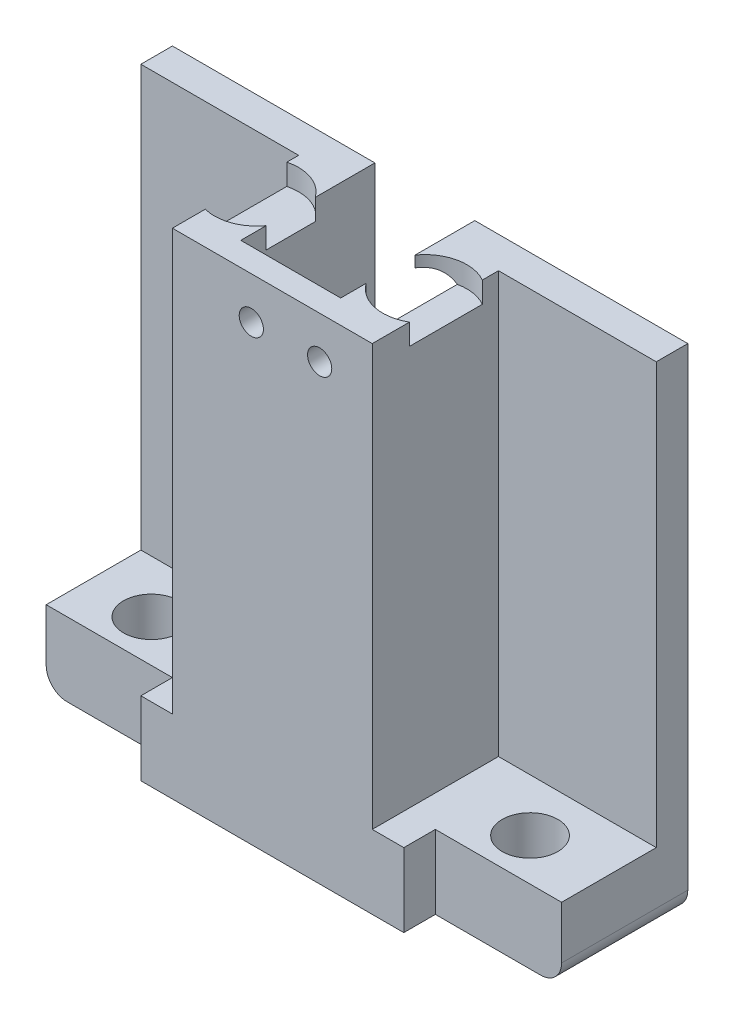
ISO-10303-21;
HEADER;
FILE_DESCRIPTION(('STEP AP214'),'2;1');
FILE_NAME('part.step','',(''),(''),'','','');
FILE_SCHEMA(('AUTOMOTIVE_DESIGN { 1 0 10303 214 1 1 1 1 }'));
ENDSEC;
DATA;
#1=APPLICATION_CONTEXT('core data for automotive mechanical design processes');
#2=APPLICATION_PROTOCOL_DEFINITION('international standard','automotive_design',2000,#1);
#3=PRODUCT_CONTEXT('',#1,'mechanical');
#4=PRODUCT('Part','Part','',(#3));
#5=PRODUCT_RELATED_PRODUCT_CATEGORY('part','',(#4));
#6=PRODUCT_DEFINITION_FORMATION('','',#4);
#7=PRODUCT_DEFINITION_CONTEXT('part definition',#1,'design');
#8=PRODUCT_DEFINITION('design','',#6,#7);
#9=PRODUCT_DEFINITION_SHAPE('','',#8);
#10=(LENGTH_UNIT() NAMED_UNIT(*) SI_UNIT(.MILLI.,.METRE.));
#11=(NAMED_UNIT(*) PLANE_ANGLE_UNIT() SI_UNIT($,.RADIAN.));
#12=(NAMED_UNIT(*) SI_UNIT($,.STERADIAN.) SOLID_ANGLE_UNIT());
#13=UNCERTAINTY_MEASURE_WITH_UNIT(LENGTH_MEASURE(1.E-05),#10,'distance_accuracy_value','');
#14=(GEOMETRIC_REPRESENTATION_CONTEXT(3) GLOBAL_UNCERTAINTY_ASSIGNED_CONTEXT((#13)) GLOBAL_UNIT_ASSIGNED_CONTEXT((#10,
#11,#12)) REPRESENTATION_CONTEXT('',''));
#15=CARTESIAN_POINT('',(0.,0.,0.));
#16=DIRECTION('',(0.,0.,1.));
#17=DIRECTION('',(1.,0.,0.));
#18=AXIS2_PLACEMENT_3D('',#15,#16,#17);
#19=CARTESIAN_POINT('',(0.,47.,0.));
#20=DIRECTION('',(0.,1.,0.));
#21=DIRECTION('',(0.,0.,1.));
#22=AXIS2_PLACEMENT_3D('',#19,#20,#21);
#23=PLANE('',#22);
#24=CARTESIAN_POINT('',(-17.,47.,8.));
#25=DIRECTION('',(0.,1.,0.));
#26=DIRECTION('',(0.,0.,1.));
#27=AXIS2_PLACEMENT_3D('',#24,#25,#26);
#28=CIRCLE('',#27,4.);
#29=CARTESIAN_POINT('',(-15.,47.,4.53589838486224));
#30=VERTEX_POINT('',#29);
#31=CARTESIAN_POINT('',(-20.25,47.,5.66815523672779));
#32=VERTEX_POINT('',#31);
#33=EDGE_CURVE('E271',#30,#32,#28,.T.);
#34=ORIENTED_EDGE('',*,*,#33,.F.);
#35=DIRECTION('',(0.,0.,1.));
#36=VECTOR('',#35,1.);
#37=CARTESIAN_POINT('',(-15.,47.,0.));
#38=LINE('',#37,#36);
#39=CARTESIAN_POINT('',(-15.,47.,3.));
#40=VERTEX_POINT('',#39);
#41=EDGE_CURVE('E558',#40,#30,#38,.T.);
#42=ORIENTED_EDGE('',*,*,#41,.F.);
#43=DIRECTION('',(-1.,0.,0.));
#44=VECTOR('',#43,1.);
#45=CARTESIAN_POINT('',(0.,47.,3.));
#46=LINE('',#45,#44);
#47=CARTESIAN_POINT('',(0.,47.,3.));
#48=VERTEX_POINT('',#47);
#49=EDGE_CURVE('E395',#48,#40,#46,.T.);
#50=ORIENTED_EDGE('',*,*,#49,.F.);
#51=DIRECTION('',(0.,0.,-1.));
#52=VECTOR('',#51,1.);
#53=CARTESIAN_POINT('',(0.,47.,16.));
#54=LINE('',#53,#52);
#55=CARTESIAN_POINT('',(0.,47.,0.));
#56=VERTEX_POINT('',#55);
#57=EDGE_CURVE('E406',#48,#56,#54,.T.);
#58=ORIENTED_EDGE('',*,*,#57,.T.);
#59=DIRECTION('',(-1.,0.,0.));
#60=VECTOR('',#59,1.);
#61=CARTESIAN_POINT('',(0.,47.,0.));
#62=LINE('',#61,#60);
#63=CARTESIAN_POINT('',(-20.25,47.,0.));
#64=VERTEX_POINT('',#63);
#65=EDGE_CURVE('E403',#56,#64,#62,.T.);
#66=ORIENTED_EDGE('',*,*,#65,.T.);
#67=DIRECTION('',(0.,0.,1.));
#68=VECTOR('',#67,1.);
#69=CARTESIAN_POINT('',(-20.25,47.,0.));
#70=LINE('',#69,#68);
#71=EDGE_CURVE('E399',#64,#32,#70,.T.);
#72=ORIENTED_EDGE('',*,*,#71,.T.);
#73=EDGE_LOOP('',(#34,#42,#50,#58,#66,#72));
#74=FACE_BOUND('',#73,.T.);
#75=ADVANCED_FACE('F48',(#74),#23,.T.);
#76=CARTESIAN_POINT('',(-33.,47.,8.));
#77=DIRECTION('',(0.,1.,0.));
#78=DIRECTION('',(0.,0.,-1.));
#79=AXIS2_PLACEMENT_3D('',#76,#77,#78);
#80=CIRCLE('',#79,4.);
#81=CARTESIAN_POINT('',(-29.75,47.,5.6681552367278));
#82=VERTEX_POINT('',#81);
#83=CARTESIAN_POINT('',(-34.,47.,4.12701665379259));
#84=VERTEX_POINT('',#83);
#85=EDGE_CURVE('E701',#82,#84,#80,.T.);
#86=ORIENTED_EDGE('',*,*,#85,.F.);
#87=DIRECTION('',(0.,0.,-1.));
#88=VECTOR('',#87,1.);
#89=CARTESIAN_POINT('',(-29.75,47.,12.75));
#90=LINE('',#89,#88);
#91=CARTESIAN_POINT('',(-29.75,47.,0.));
#92=VERTEX_POINT('',#91);
#93=EDGE_CURVE('E387',#82,#92,#90,.T.);
#94=ORIENTED_EDGE('',*,*,#93,.T.);
#95=DIRECTION('',(-1.,0.,0.));
#96=VECTOR('',#95,1.);
#97=CARTESIAN_POINT('',(0.,47.,0.));
#98=LINE('',#97,#96);
#99=CARTESIAN_POINT('',(-49.,47.,0.));
#100=VERTEX_POINT('',#99);
#101=EDGE_CURVE('E384',#92,#100,#98,.T.);
#102=ORIENTED_EDGE('',*,*,#101,.T.);
#103=DIRECTION('',(0.,0.,1.));
#104=VECTOR('',#103,1.);
#105=CARTESIAN_POINT('',(-49.,47.,0.));
#106=LINE('',#105,#104);
#107=CARTESIAN_POINT('',(-49.,47.,3.));
#108=VERTEX_POINT('',#107);
#109=EDGE_CURVE('E551',#100,#108,#106,.T.);
#110=ORIENTED_EDGE('',*,*,#109,.T.);
#111=DIRECTION('',(-1.,0.,0.));
#112=VECTOR('',#111,1.);
#113=CARTESIAN_POINT('',(0.,47.,3.));
#114=LINE('',#113,#112);
#115=CARTESIAN_POINT('',(-34.,47.,3.));
#116=VERTEX_POINT('',#115);
#117=EDGE_CURVE('E380',#116,#108,#114,.T.);
#118=ORIENTED_EDGE('',*,*,#117,.F.);
#119=DIRECTION('',(0.,0.,-1.));
#120=VECTOR('',#119,1.);
#121=CARTESIAN_POINT('',(-34.,47.,0.));
#122=LINE('',#121,#120);
#123=EDGE_CURVE('E561',#84,#116,#122,.T.);
#124=ORIENTED_EDGE('',*,*,#123,.F.);
#125=EDGE_LOOP('',(#86,#94,#102,#110,#118,#124));
#126=FACE_BOUND('',#125,.T.);
#127=ADVANCED_FACE('F609',(#126),#23,.T.);
#128=CARTESIAN_POINT('',(-20.25,53.,0.));
#129=DIRECTION('',(1.,0.,0.));
#130=DIRECTION('',(0.,0.,-1.));
#131=AXIS2_PLACEMENT_3D('',#128,#129,#130);
#132=PLANE('',#131);
#133=DIRECTION('',(0.,0.,-1.));
#134=VECTOR('',#133,1.);
#135=CARTESIAN_POINT('',(-20.25,45.9393876913398,21.2352813742386));
#136=LINE('',#135,#134);
#137=CARTESIAN_POINT('',(-20.25,45.9393876913398,0.));
#138=VERTEX_POINT('',#137);
#139=CARTESIAN_POINT('',(-20.25,45.9393876913398,5.66815523672779));
#140=VERTEX_POINT('',#139);
#141=EDGE_CURVE('E315',#138,#140,#136,.F.);
#142=ORIENTED_EDGE('',*,*,#141,.T.);
#143=DIRECTION('',(0.,1.,0.));
#144=VECTOR('',#143,1.);
#145=CARTESIAN_POINT('',(-20.25,45.,5.66815523672779));
#146=LINE('',#145,#144);
#147=EDGE_CURVE('E277',#140,#32,#146,.T.);
#148=ORIENTED_EDGE('',*,*,#147,.T.);
#149=ORIENTED_EDGE('',*,*,#71,.F.);
#150=DIRECTION('',(0.,-1.,0.));
#151=VECTOR('',#150,1.);
#152=CARTESIAN_POINT('',(-20.25,53.,0.));
#153=LINE('',#152,#151);
#154=EDGE_CURVE('E499',#64,#138,#153,.T.);
#155=ORIENTED_EDGE('',*,*,#154,.T.);
#156=EDGE_LOOP('',(#142,#148,#149,#155));
#157=FACE_BOUND('',#156,.T.);
#158=ADVANCED_FACE('F616',(#157),#132,.F.);
#159=CARTESIAN_POINT('',(-12.,0.,12.));
#160=DIRECTION('',(-1.,0.,0.));
#161=DIRECTION('',(0.,-1.,0.));
#162=AXIS2_PLACEMENT_3D('',#159,#160,#161);
#163=PLANE('',#162);
#164=DIRECTION('',(0.,1.,0.));
#165=VECTOR('',#164,1.);
#166=CARTESIAN_POINT('',(-12.,0.,15.));
#167=LINE('',#166,#165);
#168=CARTESIAN_POINT('',(-12.,0.,15.));
#169=VERTEX_POINT('',#168);
#170=CARTESIAN_POINT('',(-12.,7.,15.));
#171=VERTEX_POINT('',#170);
#172=EDGE_CURVE('E334',#169,#171,#167,.T.);
#173=ORIENTED_EDGE('',*,*,#172,.F.);
#174=DIRECTION('',(0.,0.,1.));
#175=VECTOR('',#174,1.);
#176=CARTESIAN_POINT('',(-12.,0.,12.));
#177=LINE('',#176,#175);
#178=CARTESIAN_POINT('',(-12.,0.,12.));
#179=VERTEX_POINT('',#178);
#180=EDGE_CURVE('E457',#179,#169,#177,.T.);
#181=ORIENTED_EDGE('',*,*,#180,.F.);
#182=DIRECTION('',(0.,-1.,0.));
#183=VECTOR('',#182,1.);
#184=CARTESIAN_POINT('',(-12.,0.,12.));
#185=LINE('',#184,#183);
#186=CARTESIAN_POINT('',(-12.,7.,12.));
#187=VERTEX_POINT('',#186);
#188=EDGE_CURVE('E451',#187,#179,#185,.T.);
#189=ORIENTED_EDGE('',*,*,#188,.F.);
#190=DIRECTION('',(0.,0.,1.));
#191=VECTOR('',#190,1.);
#192=CARTESIAN_POINT('',(-12.,7.,-43.0977222864644));
#193=LINE('',#192,#191);
#194=EDGE_CURVE('E369',#187,#171,#193,.T.);
#195=ORIENTED_EDGE('',*,*,#194,.T.);
#196=EDGE_LOOP('',(#173,#181,#189,#195));
#197=FACE_BOUND('',#196,.T.);
#198=ADVANCED_FACE('F857',(#197),#163,.F.);
#199=CARTESIAN_POINT('',(-37.,0.,12.));
#200=DIRECTION('',(-1.,0.,0.));
#201=DIRECTION('',(0.,-1.,0.));
#202=AXIS2_PLACEMENT_3D('',#199,#200,#201);
#203=PLANE('',#202);
#204=DIRECTION('',(0.,0.,1.));
#205=VECTOR('',#204,1.);
#206=CARTESIAN_POINT('',(-37.,0.,12.));
#207=LINE('',#206,#205);
#208=CARTESIAN_POINT('',(-37.,0.,12.));
#209=VERTEX_POINT('',#208);
#210=CARTESIAN_POINT('',(-37.,0.,15.));
#211=VERTEX_POINT('',#210);
#212=EDGE_CURVE('E464',#209,#211,#207,.T.);
#213=ORIENTED_EDGE('',*,*,#212,.T.);
#214=DIRECTION('',(0.,-1.,0.));
#215=VECTOR('',#214,1.);
#216=CARTESIAN_POINT('',(-37.,7.,15.));
#217=LINE('',#216,#215);
#218=CARTESIAN_POINT('',(-37.,7.,15.));
#219=VERTEX_POINT('',#218);
#220=EDGE_CURVE('E328',#219,#211,#217,.T.);
#221=ORIENTED_EDGE('',*,*,#220,.F.);
#222=DIRECTION('',(0.,0.,1.));
#223=VECTOR('',#222,1.);
#224=CARTESIAN_POINT('',(-37.,7.,-43.0977222864644));
#225=LINE('',#224,#223);
#226=CARTESIAN_POINT('',(-37.,7.,12.));
#227=VERTEX_POINT('',#226);
#228=EDGE_CURVE('E361',#227,#219,#225,.T.);
#229=ORIENTED_EDGE('',*,*,#228,.F.);
#230=DIRECTION('',(0.,-1.,0.));
#231=VECTOR('',#230,1.);
#232=CARTESIAN_POINT('',(-37.,0.,12.));
#233=LINE('',#232,#231);
#234=EDGE_CURVE('E460',#227,#209,#233,.T.);
#235=ORIENTED_EDGE('',*,*,#234,.T.);
#236=EDGE_LOOP('',(#213,#221,#229,#235));
#237=FACE_BOUND('',#236,.T.);
#238=ADVANCED_FACE('F863',(#237),#203,.T.);
#239=CARTESIAN_POINT('',(-55.,0.,16.));
#240=DIRECTION('',(0.,1.,0.));
#241=DIRECTION('',(0.,0.,1.));
#242=AXIS2_PLACEMENT_3D('',#239,#240,#241);
#243=PLANE('',#242);
#244=CARTESIAN_POINT('',(-43.,0.,8.));
#245=DIRECTION('',(0.,-1.,0.));
#246=DIRECTION('',(0.,0.,-1.));
#247=AXIS2_PLACEMENT_3D('',#244,#245,#246);
#248=CIRCLE('',#247,2.65);
#249=CARTESIAN_POINT('',(-43.,0.,5.35));
#250=VERTEX_POINT('',#249);
#251=EDGE_CURVE('E509',#250,#250,#248,.T.);
#252=ORIENTED_EDGE('',*,*,#251,.F.);
#253=EDGE_LOOP('',(#252));
#254=FACE_BOUND('',#253,.T.);
#255=CARTESIAN_POINT('',(-7.,0.,8.));
#256=DIRECTION('',(0.,-1.,0.));
#257=DIRECTION('',(0.,0.,-1.));
#258=AXIS2_PLACEMENT_3D('',#255,#256,#257);
#259=CIRCLE('',#258,2.65);
#260=CARTESIAN_POINT('',(-7.,0.,5.35));
#261=VERTEX_POINT('',#260);
#262=EDGE_CURVE('E497',#261,#261,#259,.T.);
#263=ORIENTED_EDGE('',*,*,#262,.F.);
#264=EDGE_LOOP('',(#263));
#265=FACE_BOUND('',#264,.T.);
#266=DIRECTION('',(1.,0.,0.));
#267=VECTOR('',#266,1.);
#268=CARTESIAN_POINT('',(-37.,0.,15.));
#269=LINE('',#268,#267);
#270=EDGE_CURVE('E331',#211,#169,#269,.T.);
#271=ORIENTED_EDGE('',*,*,#270,.F.);
#272=ORIENTED_EDGE('',*,*,#212,.F.);
#273=DIRECTION('',(1.,0.,0.));
#274=VECTOR('',#273,1.);
#275=CARTESIAN_POINT('',(0.,0.,12.));
#276=LINE('',#275,#274);
#277=CARTESIAN_POINT('',(-47.,0.,12.));
#278=VERTEX_POINT('',#277);
#279=EDGE_CURVE('E456',#278,#209,#276,.T.);
#280=ORIENTED_EDGE('',*,*,#279,.F.);
#281=DIRECTION('',(0.,0.,1.));
#282=VECTOR('',#281,1.);
#283=CARTESIAN_POINT('',(-47.,0.,16.));
#284=LINE('',#283,#282);
#285=CARTESIAN_POINT('',(-47.,0.,0.));
#286=VERTEX_POINT('',#285);
#287=EDGE_CURVE('E548',#278,#286,#284,.F.);
#288=ORIENTED_EDGE('',*,*,#287,.T.);
#289=DIRECTION('',(1.,0.,0.));
#290=VECTOR('',#289,1.);
#291=CARTESIAN_POINT('',(-55.,0.,0.));
#292=LINE('',#291,#290);
#293=CARTESIAN_POINT('',(-29.75,0.,0.));
#294=VERTEX_POINT('',#293);
#295=EDGE_CURVE('E517',#286,#294,#292,.T.);
#296=ORIENTED_EDGE('',*,*,#295,.T.);
#297=DIRECTION('',(0.,0.,-1.));
#298=VECTOR('',#297,1.);
#299=CARTESIAN_POINT('',(-29.75,0.,12.75));
#300=LINE('',#299,#298);
#301=CARTESIAN_POINT('',(-29.75,0.,12.75));
#302=VERTEX_POINT('',#301);
#303=EDGE_CURVE('E484',#302,#294,#300,.T.);
#304=ORIENTED_EDGE('',*,*,#303,.F.);
#305=DIRECTION('',(-1.,0.,0.));
#306=VECTOR('',#305,1.);
#307=CARTESIAN_POINT('',(-20.25,0.,12.75));
#308=LINE('',#307,#306);
#309=CARTESIAN_POINT('',(-20.25,0.,12.75));
#310=VERTEX_POINT('',#309);
#311=EDGE_CURVE('E468',#310,#302,#308,.T.);
#312=ORIENTED_EDGE('',*,*,#311,.F.);
#313=DIRECTION('',(0.,0.,1.));
#314=VECTOR('',#313,1.);
#315=CARTESIAN_POINT('',(-20.25,0.,0.));
#316=LINE('',#315,#314);
#317=CARTESIAN_POINT('',(-20.25,0.,0.));
#318=VERTEX_POINT('',#317);
#319=EDGE_CURVE('E488',#318,#310,#316,.T.);
#320=ORIENTED_EDGE('',*,*,#319,.F.);
#321=CARTESIAN_POINT('',(-2.,0.,0.));
#322=VERTEX_POINT('',#321);
#323=EDGE_CURVE('E513',#318,#322,#292,.T.);
#324=ORIENTED_EDGE('',*,*,#323,.T.);
#325=DIRECTION('',(0.,0.,-1.));
#326=VECTOR('',#325,1.);
#327=CARTESIAN_POINT('',(-2.,0.,16.));
#328=LINE('',#327,#326);
#329=CARTESIAN_POINT('',(-2.,0.,12.));
#330=VERTEX_POINT('',#329);
#331=EDGE_CURVE('E532',#322,#330,#328,.F.);
#332=ORIENTED_EDGE('',*,*,#331,.T.);
#333=DIRECTION('',(1.,0.,0.));
#334=VECTOR('',#333,1.);
#335=CARTESIAN_POINT('',(0.,0.,12.));
#336=LINE('',#335,#334);
#337=EDGE_CURVE('E471',#179,#330,#336,.T.);
#338=ORIENTED_EDGE('',*,*,#337,.F.);
#339=ORIENTED_EDGE('',*,*,#180,.T.);
#340=EDGE_LOOP('',(#271,#272,#280,#288,#296,#304,#312,#320,#324,#332,#338,#339));
#341=FACE_BOUND('',#340,.T.);
#342=ADVANCED_FACE('F779',(#254,#265,#341),#243,.F.);
#343=CARTESIAN_POINT('',(-49.,7.,3.));
#344=DIRECTION('',(0.,-1.,0.));
#345=DIRECTION('',(0.,0.,-1.));
#346=AXIS2_PLACEMENT_3D('',#343,#344,#345);
#347=PLANE('',#346);
#348=CARTESIAN_POINT('',(-43.,7.,8.));
#349=DIRECTION('',(0.,-1.,0.));
#350=DIRECTION('',(0.,0.,-1.));
#351=AXIS2_PLACEMENT_3D('',#348,#349,#350);
#352=CIRCLE('',#351,2.65);
#353=CARTESIAN_POINT('',(-43.,7.,5.35));
#354=VERTEX_POINT('',#353);
#355=EDGE_CURVE('E429',#354,#354,#352,.F.);
#356=ORIENTED_EDGE('',*,*,#355,.F.);
#357=EDGE_LOOP('',(#356));
#358=FACE_BOUND('',#357,.T.);
#359=DIRECTION('',(-1.,0.,0.));
#360=VECTOR('',#359,1.);
#361=CARTESIAN_POINT('',(-34.,7.,15.));
#362=LINE('',#361,#360);
#363=CARTESIAN_POINT('',(-34.,7.,15.));
#364=VERTEX_POINT('',#363);
#365=EDGE_CURVE('E325',#364,#219,#362,.T.);
#366=ORIENTED_EDGE('',*,*,#365,.F.);
#367=DIRECTION('',(0.,0.,1.));
#368=VECTOR('',#367,1.);
#369=CARTESIAN_POINT('',(-34.,7.,-43.0977222864644));
#370=LINE('',#369,#368);
#371=CARTESIAN_POINT('',(-34.,7.,3.));
#372=VERTEX_POINT('',#371);
#373=EDGE_CURVE('E357',#372,#364,#370,.T.);
#374=ORIENTED_EDGE('',*,*,#373,.F.);
#375=DIRECTION('',(1.,0.,0.));
#376=VECTOR('',#375,1.);
#377=CARTESIAN_POINT('',(-49.,7.,3.));
#378=LINE('',#377,#376);
#379=CARTESIAN_POINT('',(-49.,7.,3.));
#380=VERTEX_POINT('',#379);
#381=EDGE_CURVE('E417',#380,#372,#378,.T.);
#382=ORIENTED_EDGE('',*,*,#381,.F.);
#383=DIRECTION('',(0.,0.,1.));
#384=VECTOR('',#383,1.);
#385=CARTESIAN_POINT('',(-49.,7.,3.));
#386=LINE('',#385,#384);
#387=CARTESIAN_POINT('',(-49.,7.,12.));
#388=VERTEX_POINT('',#387);
#389=EDGE_CURVE('E421',#380,#388,#386,.T.);
#390=ORIENTED_EDGE('',*,*,#389,.T.);
#391=DIRECTION('',(1.,0.,0.));
#392=VECTOR('',#391,1.);
#393=CARTESIAN_POINT('',(-49.,7.,12.));
#394=LINE('',#393,#392);
#395=EDGE_CURVE('E418',#388,#227,#394,.T.);
#396=ORIENTED_EDGE('',*,*,#395,.T.);
#397=ORIENTED_EDGE('',*,*,#228,.T.);
#398=EDGE_LOOP('',(#366,#374,#382,#390,#396,#397));
#399=FACE_BOUND('',#398,.T.);
#400=ADVANCED_FACE('F631',(#358,#399),#347,.F.);
#401=CARTESIAN_POINT('',(-12.,7.,3.));
#402=DIRECTION('',(0.,-1.,0.));
#403=DIRECTION('',(0.,0.,-1.));
#404=AXIS2_PLACEMENT_3D('',#401,#402,#403);
#405=PLANE('',#404);
#406=CARTESIAN_POINT('',(-7.,7.,8.));
#407=DIRECTION('',(0.,-1.,0.));
#408=DIRECTION('',(0.,0.,-1.));
#409=AXIS2_PLACEMENT_3D('',#406,#407,#408);
#410=CIRCLE('',#409,2.65);
#411=CARTESIAN_POINT('',(-7.,7.,5.35));
#412=VERTEX_POINT('',#411);
#413=EDGE_CURVE('E447',#412,#412,#410,.F.);
#414=ORIENTED_EDGE('',*,*,#413,.F.);
#415=EDGE_LOOP('',(#414));
#416=FACE_BOUND('',#415,.T.);
#417=DIRECTION('',(-1.,0.,0.));
#418=VECTOR('',#417,1.);
#419=CARTESIAN_POINT('',(-12.,7.,15.));
#420=LINE('',#419,#418);
#421=CARTESIAN_POINT('',(-15.,7.,15.));
#422=VERTEX_POINT('',#421);
#423=EDGE_CURVE('E337',#171,#422,#420,.T.);
#424=ORIENTED_EDGE('',*,*,#423,.F.);
#425=ORIENTED_EDGE('',*,*,#194,.F.);
#426=DIRECTION('',(1.,0.,0.));
#427=VECTOR('',#426,1.);
#428=CARTESIAN_POINT('',(-12.,7.,12.));
#429=LINE('',#428,#427);
#430=CARTESIAN_POINT('',(0.,7.,12.));
#431=VERTEX_POINT('',#430);
#432=EDGE_CURVE('E425',#187,#431,#429,.T.);
#433=ORIENTED_EDGE('',*,*,#432,.T.);
#434=DIRECTION('',(0.,0.,1.));
#435=VECTOR('',#434,1.);
#436=CARTESIAN_POINT('',(0.,7.,3.));
#437=LINE('',#436,#435);
#438=CARTESIAN_POINT('',(0.,7.,3.));
#439=VERTEX_POINT('',#438);
#440=EDGE_CURVE('E413',#439,#431,#437,.T.);
#441=ORIENTED_EDGE('',*,*,#440,.F.);
#442=DIRECTION('',(1.,0.,0.));
#443=VECTOR('',#442,1.);
#444=CARTESIAN_POINT('',(-12.,7.,3.));
#445=LINE('',#444,#443);
#446=CARTESIAN_POINT('',(-15.,7.,3.));
#447=VERTEX_POINT('',#446);
#448=EDGE_CURVE('E437',#447,#439,#445,.T.);
#449=ORIENTED_EDGE('',*,*,#448,.F.);
#450=DIRECTION('',(0.,0.,1.));
#451=VECTOR('',#450,1.);
#452=CARTESIAN_POINT('',(-15.,7.,-43.0977222864644));
#453=LINE('',#452,#451);
#454=EDGE_CURVE('E365',#447,#422,#453,.T.);
#455=ORIENTED_EDGE('',*,*,#454,.T.);
#456=EDGE_LOOP('',(#424,#425,#433,#441,#449,#455));
#457=FACE_BOUND('',#456,.T.);
#458=ADVANCED_FACE('F623',(#416,#457),#405,.F.);
#459=CARTESIAN_POINT('',(-20.25,47.,10.3318447632722));
#460=VERTEX_POINT('',#459);
#461=CARTESIAN_POINT('',(-15.,47.,11.4641016151378));
#462=VERTEX_POINT('',#461);
#463=EDGE_CURVE('E258',#460,#462,#28,.T.);
#464=ORIENTED_EDGE('',*,*,#463,.F.);
#465=CARTESIAN_POINT('',(-20.25,47.,12.75));
#466=VERTEX_POINT('',#465);
#467=EDGE_CURVE('E398',#460,#466,#70,.T.);
#468=ORIENTED_EDGE('',*,*,#467,.T.);
#469=DIRECTION('',(-1.,0.,0.));
#470=VECTOR('',#469,1.);
#471=CARTESIAN_POINT('',(-20.25,47.,12.75));
#472=LINE('',#471,#470);
#473=CARTESIAN_POINT('',(-29.75,47.,12.75));
#474=VERTEX_POINT('',#473);
#475=EDGE_CURVE('E392',#466,#474,#472,.T.);
#476=ORIENTED_EDGE('',*,*,#475,.T.);
#477=CARTESIAN_POINT('',(-29.75,47.,10.3318447632722));
#478=VERTEX_POINT('',#477);
#479=EDGE_CURVE('E388',#474,#478,#90,.T.);
#480=ORIENTED_EDGE('',*,*,#479,.T.);
#481=CARTESIAN_POINT('',(-34.,47.,11.8729833462074));
#482=VERTEX_POINT('',#481);
#483=EDGE_CURVE('E638',#482,#478,#80,.T.);
#484=ORIENTED_EDGE('',*,*,#483,.F.);
#485=CARTESIAN_POINT('',(-34.,47.,15.));
#486=VERTEX_POINT('',#485);
#487=EDGE_CURVE('E562',#486,#482,#122,.T.);
#488=ORIENTED_EDGE('',*,*,#487,.F.);
#489=DIRECTION('',(-1.,0.,0.));
#490=VECTOR('',#489,1.);
#491=CARTESIAN_POINT('',(-15.,47.,15.));
#492=LINE('',#491,#490);
#493=CARTESIAN_POINT('',(-15.,47.,15.));
#494=VERTEX_POINT('',#493);
#495=EDGE_CURVE('E319',#494,#486,#492,.T.);
#496=ORIENTED_EDGE('',*,*,#495,.F.);
#497=EDGE_CURVE('E554',#462,#494,#38,.T.);
#498=ORIENTED_EDGE('',*,*,#497,.F.);
#499=EDGE_LOOP('',(#464,#468,#476,#480,#484,#488,#496,#498));
#500=FACE_BOUND('',#499,.T.);
#501=ADVANCED_FACE('F612',(#500),#23,.T.);
#502=CARTESIAN_POINT('',(-20.,43.,0.));
#503=DIRECTION('',(0.,0.,1.));
#504=DIRECTION('',(1.,0.,0.));
#505=AXIS2_PLACEMENT_3D('',#502,#503,#504);
#506=CYLINDRICAL_SURFACE('',#505,1.15);
#507=CARTESIAN_POINT('',(-20.,43.,12.75));
#508=DIRECTION('',(0.,0.,1.));
#509=DIRECTION('',(1.,0.,0.));
#510=AXIS2_PLACEMENT_3D('',#507,#508,#509);
#511=CIRCLE('',#510,1.15);
#512=CARTESIAN_POINT('',(-18.85,43.,12.75));
#513=VERTEX_POINT('',#512);
#514=EDGE_CURVE('E356',#513,#513,#511,.T.);
#515=ORIENTED_EDGE('',*,*,#514,.F.);
#516=EDGE_LOOP('',(#515));
#517=FACE_BOUND('',#516,.T.);
#518=CARTESIAN_POINT('',(-20.,43.,15.));
#519=DIRECTION('',(0.,0.,1.));
#520=DIRECTION('',(1.,0.,0.));
#521=AXIS2_PLACEMENT_3D('',#518,#519,#520);
#522=CIRCLE('',#521,1.15);
#523=CARTESIAN_POINT('',(-18.85,43.,15.));
#524=VERTEX_POINT('',#523);
#525=EDGE_CURVE('E348',#524,#524,#522,.F.);
#526=ORIENTED_EDGE('',*,*,#525,.F.);
#527=EDGE_LOOP('',(#526));
#528=FACE_BOUND('',#527,.T.);
#529=ADVANCED_FACE('F622',(#517,#528),#506,.F.);
#530=CARTESIAN_POINT('',(-26.5,43.,0.));
#531=DIRECTION('',(0.,0.,1.));
#532=DIRECTION('',(1.,0.,0.));
#533=AXIS2_PLACEMENT_3D('',#530,#531,#532);
#534=CYLINDRICAL_SURFACE('',#533,1.15);
#535=CARTESIAN_POINT('',(-26.5,43.,12.75));
#536=DIRECTION('',(0.,0.,1.));
#537=DIRECTION('',(1.,0.,0.));
#538=AXIS2_PLACEMENT_3D('',#535,#536,#537);
#539=CIRCLE('',#538,1.15);
#540=CARTESIAN_POINT('',(-25.35,43.,12.75));
#541=VERTEX_POINT('',#540);
#542=EDGE_CURVE('E379',#541,#541,#539,.T.);
#543=ORIENTED_EDGE('',*,*,#542,.F.);
#544=EDGE_LOOP('',(#543));
#545=FACE_BOUND('',#544,.T.);
#546=CARTESIAN_POINT('',(-26.5,43.,15.));
#547=DIRECTION('',(0.,0.,1.));
#548=DIRECTION('',(1.,0.,0.));
#549=AXIS2_PLACEMENT_3D('',#546,#547,#548);
#550=CIRCLE('',#549,1.15);
#551=CARTESIAN_POINT('',(-25.35,43.,15.));
#552=VERTEX_POINT('',#551);
#553=EDGE_CURVE('E344',#552,#552,#550,.F.);
#554=ORIENTED_EDGE('',*,*,#553,.F.);
#555=EDGE_LOOP('',(#554));
#556=FACE_BOUND('',#555,.T.);
#557=ADVANCED_FACE('F629',(#545,#556),#534,.F.);
#558=CARTESIAN_POINT('',(-15.,53.,-43.0977222864644));
#559=DIRECTION('',(-1.,0.,0.));
#560=DIRECTION('',(0.,-1.,0.));
#561=AXIS2_PLACEMENT_3D('',#558,#559,#560);
#562=PLANE('',#561);
#563=DIRECTION('',(0.,0.,-1.));
#564=VECTOR('',#563,1.);
#565=CARTESIAN_POINT('',(-15.,45.,-43.0977222864644));
#566=LINE('',#565,#564);
#567=CARTESIAN_POINT('',(-15.,45.,11.4641016151378));
#568=VERTEX_POINT('',#567);
#569=CARTESIAN_POINT('',(-15.,45.,4.53589838486224));
#570=VERTEX_POINT('',#569);
#571=EDGE_CURVE('E267',#568,#570,#566,.T.);
#572=ORIENTED_EDGE('',*,*,#571,.F.);
#573=DIRECTION('',(0.,1.,0.));
#574=VECTOR('',#573,1.);
#575=CARTESIAN_POINT('',(-15.,45.,11.4641016151378));
#576=LINE('',#575,#574);
#577=EDGE_CURVE('E252',#568,#462,#576,.T.);
#578=ORIENTED_EDGE('',*,*,#577,.T.);
#579=ORIENTED_EDGE('',*,*,#497,.T.);
#580=DIRECTION('',(0.,1.,0.));
#581=VECTOR('',#580,1.);
#582=CARTESIAN_POINT('',(-15.,7.,15.));
#583=LINE('',#582,#581);
#584=EDGE_CURVE('E340',#422,#494,#583,.T.);
#585=ORIENTED_EDGE('',*,*,#584,.F.);
#586=ORIENTED_EDGE('',*,*,#454,.F.);
#587=DIRECTION('',(0.,1.,0.));
#588=VECTOR('',#587,1.);
#589=CARTESIAN_POINT('',(-15.,53.,3.));
#590=LINE('',#589,#588);
#591=EDGE_CURVE('E351',#447,#40,#590,.T.);
#592=ORIENTED_EDGE('',*,*,#591,.T.);
#593=ORIENTED_EDGE('',*,*,#41,.T.);
#594=DIRECTION('',(0.,1.,0.));
#595=VECTOR('',#594,1.);
#596=CARTESIAN_POINT('',(-15.,45.,4.53589838486224));
#597=LINE('',#596,#595);
#598=EDGE_CURVE('E264',#30,#570,#597,.F.);
#599=ORIENTED_EDGE('',*,*,#598,.T.);
#600=EDGE_LOOP('',(#572,#578,#579,#585,#586,#592,#593,#599));
#601=FACE_BOUND('',#600,.T.);
#602=ADVANCED_FACE('F274',(#601),#562,.F.);
#603=CARTESIAN_POINT('',(-34.,53.,-43.0977222864644));
#604=DIRECTION('',(1.,0.,0.));
#605=DIRECTION('',(0.,1.,0.));
#606=AXIS2_PLACEMENT_3D('',#603,#604,#605);
#607=PLANE('',#606);
#608=DIRECTION('',(0.,0.,-1.));
#609=VECTOR('',#608,1.);
#610=CARTESIAN_POINT('',(-34.,45.,-43.0977222864644));
#611=LINE('',#610,#609);
#612=CARTESIAN_POINT('',(-34.,45.,11.8729833462074));
#613=VERTEX_POINT('',#612);
#614=CARTESIAN_POINT('',(-34.,45.,4.12701665379259));
#615=VERTEX_POINT('',#614);
#616=EDGE_CURVE('E263',#613,#615,#611,.T.);
#617=ORIENTED_EDGE('',*,*,#616,.T.);
#618=DIRECTION('',(0.,1.,0.));
#619=VECTOR('',#618,1.);
#620=CARTESIAN_POINT('',(-34.,45.,4.12701665379259));
#621=LINE('',#620,#619);
#622=EDGE_CURVE('E303',#615,#84,#621,.T.);
#623=ORIENTED_EDGE('',*,*,#622,.T.);
#624=ORIENTED_EDGE('',*,*,#123,.T.);
#625=DIRECTION('',(0.,-1.,0.));
#626=VECTOR('',#625,1.);
#627=CARTESIAN_POINT('',(-34.,53.,3.));
#628=LINE('',#627,#626);
#629=EDGE_CURVE('E352',#116,#372,#628,.T.);
#630=ORIENTED_EDGE('',*,*,#629,.T.);
#631=ORIENTED_EDGE('',*,*,#373,.T.);
#632=DIRECTION('',(0.,-1.,0.));
#633=VECTOR('',#632,1.);
#634=CARTESIAN_POINT('',(-34.,47.,15.));
#635=LINE('',#634,#633);
#636=EDGE_CURVE('E322',#486,#364,#635,.T.);
#637=ORIENTED_EDGE('',*,*,#636,.F.);
#638=ORIENTED_EDGE('',*,*,#487,.T.);
#639=DIRECTION('',(0.,1.,0.));
#640=VECTOR('',#639,1.);
#641=CARTESIAN_POINT('',(-34.,45.,11.8729833462074));
#642=LINE('',#641,#640);
#643=EDGE_CURVE('E299',#482,#613,#642,.F.);
#644=ORIENTED_EDGE('',*,*,#643,.T.);
#645=EDGE_LOOP('',(#617,#623,#624,#630,#631,#637,#638,#644));
#646=FACE_BOUND('',#645,.T.);
#647=ADVANCED_FACE('F812',(#646),#607,.F.);
#648=ORIENTED_EDGE('',*,*,#467,.F.);
#649=DIRECTION('',(0.,1.,0.));
#650=VECTOR('',#649,1.);
#651=CARTESIAN_POINT('',(-20.25,45.,10.3318447632722));
#652=LINE('',#651,#650);
#653=CARTESIAN_POINT('',(-20.25,45.9393876913398,10.3318447632722));
#654=VERTEX_POINT('',#653);
#655=EDGE_CURVE('E284',#460,#654,#652,.F.);
#656=ORIENTED_EDGE('',*,*,#655,.T.);
#657=CARTESIAN_POINT('',(-20.25,45.9393876913398,12.75));
#658=VERTEX_POINT('',#657);
#659=EDGE_CURVE('E314',#654,#658,#136,.F.);
#660=ORIENTED_EDGE('',*,*,#659,.T.);
#661=DIRECTION('',(0.,-1.,0.));
#662=VECTOR('',#661,1.);
#663=CARTESIAN_POINT('',(-20.25,53.,12.75));
#664=LINE('',#663,#662);
#665=EDGE_CURVE('E493',#466,#658,#664,.T.);
#666=ORIENTED_EDGE('',*,*,#665,.F.);
#667=EDGE_LOOP('',(#648,#656,#660,#666));
#668=FACE_BOUND('',#667,.T.);
#669=ADVANCED_FACE('F642',(#668),#132,.F.);
#670=CARTESIAN_POINT('',(0.,53.,16.));
#671=DIRECTION('',(-1.,0.,0.));
#672=DIRECTION('',(0.,-1.,0.));
#673=AXIS2_PLACEMENT_3D('',#670,#671,#672);
#674=PLANE('',#673);
#675=ORIENTED_EDGE('',*,*,#57,.F.);
#676=DIRECTION('',(0.,1.,0.));
#677=VECTOR('',#676,1.);
#678=CARTESIAN_POINT('',(0.,53.,3.));
#679=LINE('',#678,#677);
#680=EDGE_CURVE('E433',#439,#48,#679,.T.);
#681=ORIENTED_EDGE('',*,*,#680,.F.);
#682=ORIENTED_EDGE('',*,*,#440,.T.);
#683=DIRECTION('',(0.,1.,0.));
#684=VECTOR('',#683,1.);
#685=CARTESIAN_POINT('',(0.,0.,12.));
#686=LINE('',#685,#684);
#687=CARTESIAN_POINT('',(0.,2.,12.));
#688=VERTEX_POINT('',#687);
#689=EDGE_CURVE('E475',#688,#431,#686,.T.);
#690=ORIENTED_EDGE('',*,*,#689,.F.);
#691=DIRECTION('',(0.,0.,-1.));
#692=VECTOR('',#691,1.);
#693=CARTESIAN_POINT('',(0.,2.,16.));
#694=LINE('',#693,#692);
#695=CARTESIAN_POINT('',(0.,2.,0.));
#696=VERTEX_POINT('',#695);
#697=EDGE_CURVE('E528',#688,#696,#694,.T.);
#698=ORIENTED_EDGE('',*,*,#697,.T.);
#699=DIRECTION('',(0.,1.,0.));
#700=VECTOR('',#699,1.);
#701=CARTESIAN_POINT('',(0.,53.,0.));
#702=LINE('',#701,#700);
#703=EDGE_CURVE('E521',#696,#56,#702,.T.);
#704=ORIENTED_EDGE('',*,*,#703,.T.);
#705=EDGE_LOOP('',(#675,#681,#682,#690,#698,#704));
#706=FACE_BOUND('',#705,.T.);
#707=ADVANCED_FACE('F827',(#706),#674,.F.);
#708=CARTESIAN_POINT('',(0.,0.,0.));
#709=DIRECTION('',(0.,0.,1.));
#710=DIRECTION('',(1.,0.,0.));
#711=AXIS2_PLACEMENT_3D('',#708,#709,#710);
#712=PLANE('',#711);
#713=CARTESIAN_POINT('',(-20.25,40.0606123086602,0.));
#714=VERTEX_POINT('',#713);
#715=EDGE_CURVE('E503',#714,#318,#153,.T.);
#716=ORIENTED_EDGE('',*,*,#715,.F.);
#717=CARTESIAN_POINT('',(-20.,43.,0.));
#718=DIRECTION('',(0.,0.,-1.));
#719=DIRECTION('',(-1.,0.,0.));
#720=AXIS2_PLACEMENT_3D('',#717,#718,#719);
#721=CIRCLE('',#720,2.95);
#722=EDGE_CURVE('E311',#138,#714,#721,.T.);
#723=ORIENTED_EDGE('',*,*,#722,.F.);
#724=ORIENTED_EDGE('',*,*,#154,.F.);
#725=ORIENTED_EDGE('',*,*,#65,.F.);
#726=ORIENTED_EDGE('',*,*,#703,.F.);
#727=CARTESIAN_POINT('',(-2.,2.,0.));
#728=DIRECTION('',(0.,0.,1.));
#729=DIRECTION('',(1.,0.,0.));
#730=AXIS2_PLACEMENT_3D('',#727,#728,#729);
#731=CIRCLE('',#730,2.);
#732=EDGE_CURVE('E525',#696,#322,#731,.F.);
#733=ORIENTED_EDGE('',*,*,#732,.T.);
#734=ORIENTED_EDGE('',*,*,#323,.F.);
#735=EDGE_LOOP('',(#716,#723,#724,#725,#726,#733,#734));
#736=FACE_BOUND('',#735,.T.);
#737=ADVANCED_FACE('F836',(#736),#712,.F.);
#738=ORIENTED_EDGE('',*,*,#101,.F.);
#739=DIRECTION('',(0.,-1.,0.));
#740=VECTOR('',#739,1.);
#741=CARTESIAN_POINT('',(-29.75,53.,0.));
#742=LINE('',#741,#740);
#743=EDGE_CURVE('E504',#92,#294,#742,.T.);
#744=ORIENTED_EDGE('',*,*,#743,.T.);
#745=ORIENTED_EDGE('',*,*,#295,.F.);
#746=CARTESIAN_POINT('',(-47.,2.,0.));
#747=DIRECTION('',(0.,0.,1.));
#748=DIRECTION('',(1.,0.,0.));
#749=AXIS2_PLACEMENT_3D('',#746,#747,#748);
#750=CIRCLE('',#749,2.);
#751=CARTESIAN_POINT('',(-49.,2.,0.));
#752=VERTEX_POINT('',#751);
#753=EDGE_CURVE('E542',#286,#752,#750,.F.);
#754=ORIENTED_EDGE('',*,*,#753,.T.);
#755=DIRECTION('',(0.,1.,0.));
#756=VECTOR('',#755,1.);
#757=CARTESIAN_POINT('',(-49.,0.,0.));
#758=LINE('',#757,#756);
#759=EDGE_CURVE('E409',#752,#100,#758,.T.);
#760=ORIENTED_EDGE('',*,*,#759,.T.);
#761=EDGE_LOOP('',(#738,#744,#745,#754,#760));
#762=FACE_BOUND('',#761,.T.);
#763=ADVANCED_FACE('F787',(#762),#712,.F.);
#764=CARTESIAN_POINT('',(-20.25,53.,12.75));
#765=DIRECTION('',(0.,0.,1.));
#766=DIRECTION('',(1.,0.,0.));
#767=AXIS2_PLACEMENT_3D('',#764,#765,#766);
#768=PLANE('',#767);
#769=ORIENTED_EDGE('',*,*,#514,.T.);
#770=EDGE_LOOP('',(#769));
#771=FACE_BOUND('',#770,.T.);
#772=ORIENTED_EDGE('',*,*,#665,.T.);
#773=CARTESIAN_POINT('',(-20.,43.,12.75));
#774=DIRECTION('',(0.,0.,1.));
#775=DIRECTION('',(1.,0.,0.));
#776=AXIS2_PLACEMENT_3D('',#773,#774,#775);
#777=CIRCLE('',#776,2.95);
#778=CARTESIAN_POINT('',(-20.25,40.0606123086602,12.75));
#779=VERTEX_POINT('',#778);
#780=EDGE_CURVE('E307',#658,#779,#777,.F.);
#781=ORIENTED_EDGE('',*,*,#780,.T.);
#782=EDGE_CURVE('E498',#779,#310,#664,.T.);
#783=ORIENTED_EDGE('',*,*,#782,.T.);
#784=ORIENTED_EDGE('',*,*,#311,.T.);
#785=DIRECTION('',(0.,-1.,0.));
#786=VECTOR('',#785,1.);
#787=CARTESIAN_POINT('',(-29.75,53.,12.75));
#788=LINE('',#787,#786);
#789=EDGE_CURVE('E492',#474,#302,#788,.T.);
#790=ORIENTED_EDGE('',*,*,#789,.F.);
#791=ORIENTED_EDGE('',*,*,#475,.F.);
#792=EDGE_LOOP('',(#772,#781,#783,#784,#790,#791));
#793=FACE_BOUND('',#792,.T.);
#794=ORIENTED_EDGE('',*,*,#542,.T.);
#795=EDGE_LOOP('',(#794));
#796=FACE_BOUND('',#795,.T.);
#797=ADVANCED_FACE('F771',(#771,#793,#796),#768,.F.);
#798=ORIENTED_EDGE('',*,*,#782,.F.);
#799=DIRECTION('',(0.,0.,-1.));
#800=VECTOR('',#799,1.);
#801=CARTESIAN_POINT('',(-20.25,40.0606123086602,21.2352813742386));
#802=LINE('',#801,#800);
#803=EDGE_CURVE('E566',#779,#714,#802,.T.);
#804=ORIENTED_EDGE('',*,*,#803,.T.);
#805=ORIENTED_EDGE('',*,*,#715,.T.);
#806=ORIENTED_EDGE('',*,*,#319,.T.);
#807=EDGE_LOOP('',(#798,#804,#805,#806));
#808=FACE_BOUND('',#807,.T.);
#809=ADVANCED_FACE('F844',(#808),#132,.F.);
#810=CARTESIAN_POINT('',(-29.75,53.,12.75));
#811=DIRECTION('',(-1.,0.,0.));
#812=DIRECTION('',(0.,0.,1.));
#813=AXIS2_PLACEMENT_3D('',#810,#811,#812);
#814=PLANE('',#813);
#815=DIRECTION('',(0.,0.,1.));
#816=VECTOR('',#815,1.);
#817=CARTESIAN_POINT('',(-29.75,45.,12.75));
#818=LINE('',#817,#816);
#819=CARTESIAN_POINT('',(-29.75,45.,5.6681552367278));
#820=VERTEX_POINT('',#819);
#821=CARTESIAN_POINT('',(-29.75,45.,10.3318447632722));
#822=VERTEX_POINT('',#821);
#823=EDGE_CURVE('E738',#820,#822,#818,.T.);
#824=ORIENTED_EDGE('',*,*,#823,.T.);
#825=DIRECTION('',(0.,1.,0.));
#826=VECTOR('',#825,1.);
#827=CARTESIAN_POINT('',(-29.75,45.,10.3318447632722));
#828=LINE('',#827,#826);
#829=EDGE_CURVE('E12',#822,#478,#828,.T.);
#830=ORIENTED_EDGE('',*,*,#829,.T.);
#831=ORIENTED_EDGE('',*,*,#479,.F.);
#832=ORIENTED_EDGE('',*,*,#789,.T.);
#833=ORIENTED_EDGE('',*,*,#303,.T.);
#834=ORIENTED_EDGE('',*,*,#743,.F.);
#835=ORIENTED_EDGE('',*,*,#93,.F.);
#836=DIRECTION('',(0.,1.,0.));
#837=VECTOR('',#836,1.);
#838=CARTESIAN_POINT('',(-29.75,45.,5.6681552367278));
#839=LINE('',#838,#837);
#840=EDGE_CURVE('E57',#82,#820,#839,.F.);
#841=ORIENTED_EDGE('',*,*,#840,.T.);
#842=EDGE_LOOP('',(#824,#830,#831,#832,#833,#834,#835,#841));
#843=FACE_BOUND('',#842,.T.);
#844=ADVANCED_FACE('F767',(#843),#814,.F.);
#845=CARTESIAN_POINT('',(0.,0.,3.));
#846=DIRECTION('',(0.,0.,1.));
#847=DIRECTION('',(1.,0.,0.));
#848=AXIS2_PLACEMENT_3D('',#845,#846,#847);
#849=PLANE('',#848);
#850=ORIENTED_EDGE('',*,*,#381,.T.);
#851=ORIENTED_EDGE('',*,*,#629,.F.);
#852=ORIENTED_EDGE('',*,*,#117,.T.);
#853=DIRECTION('',(0.,-1.,0.));
#854=VECTOR('',#853,1.);
#855=CARTESIAN_POINT('',(-49.,53.,3.));
#856=LINE('',#855,#854);
#857=EDGE_CURVE('E414',#108,#380,#856,.T.);
#858=ORIENTED_EDGE('',*,*,#857,.T.);
#859=EDGE_LOOP('',(#850,#851,#852,#858));
#860=FACE_BOUND('',#859,.T.);
#861=ADVANCED_FACE('F805',(#860),#849,.T.);
#862=CARTESIAN_POINT('',(0.,0.,3.));
#863=DIRECTION('',(0.,0.,1.));
#864=DIRECTION('',(1.,0.,0.));
#865=AXIS2_PLACEMENT_3D('',#862,#863,#864);
#866=PLANE('',#865);
#867=ORIENTED_EDGE('',*,*,#680,.T.);
#868=ORIENTED_EDGE('',*,*,#49,.T.);
#869=ORIENTED_EDGE('',*,*,#591,.F.);
#870=ORIENTED_EDGE('',*,*,#448,.T.);
#871=EDGE_LOOP('',(#867,#868,#869,#870));
#872=FACE_BOUND('',#871,.T.);
#873=ADVANCED_FACE('F824',(#872),#866,.T.);
#874=CARTESIAN_POINT('',(-49.,0.,0.));
#875=DIRECTION('',(1.,0.,0.));
#876=DIRECTION('',(0.,0.,-1.));
#877=AXIS2_PLACEMENT_3D('',#874,#875,#876);
#878=PLANE('',#877);
#879=ORIENTED_EDGE('',*,*,#109,.F.);
#880=ORIENTED_EDGE('',*,*,#759,.F.);
#881=DIRECTION('',(0.,0.,1.));
#882=VECTOR('',#881,1.);
#883=CARTESIAN_POINT('',(-49.,2.,0.));
#884=LINE('',#883,#882);
#885=CARTESIAN_POINT('',(-49.,2.,12.));
#886=VERTEX_POINT('',#885);
#887=EDGE_CURVE('E538',#752,#886,#884,.T.);
#888=ORIENTED_EDGE('',*,*,#887,.T.);
#889=DIRECTION('',(0.,-1.,0.));
#890=VECTOR('',#889,1.);
#891=CARTESIAN_POINT('',(-49.,0.,12.));
#892=LINE('',#891,#890);
#893=EDGE_CURVE('E452',#388,#886,#892,.T.);
#894=ORIENTED_EDGE('',*,*,#893,.F.);
#895=ORIENTED_EDGE('',*,*,#389,.F.);
#896=ORIENTED_EDGE('',*,*,#857,.F.);
#897=EDGE_LOOP('',(#879,#880,#888,#894,#895,#896));
#898=FACE_BOUND('',#897,.T.);
#899=ADVANCED_FACE('F793',(#898),#878,.F.);
#900=CARTESIAN_POINT('',(-7.,53.,8.));
#901=DIRECTION('',(0.,-1.,0.));
#902=DIRECTION('',(0.,0.,-1.));
#903=AXIS2_PLACEMENT_3D('',#900,#901,#902);
#904=CYLINDRICAL_SURFACE('',#903,2.65);
#905=ORIENTED_EDGE('',*,*,#413,.T.);
#906=EDGE_LOOP('',(#905));
#907=FACE_BOUND('',#906,.T.);
#908=ORIENTED_EDGE('',*,*,#262,.T.);
#909=EDGE_LOOP('',(#908));
#910=FACE_BOUND('',#909,.T.);
#911=ADVANCED_FACE('F888',(#907,#910),#904,.F.);
#912=CARTESIAN_POINT('',(-43.,53.,8.));
#913=DIRECTION('',(0.,-1.,0.));
#914=DIRECTION('',(0.,0.,-1.));
#915=AXIS2_PLACEMENT_3D('',#912,#913,#914);
#916=CYLINDRICAL_SURFACE('',#915,2.65);
#917=ORIENTED_EDGE('',*,*,#355,.T.);
#918=EDGE_LOOP('',(#917));
#919=FACE_BOUND('',#918,.T.);
#920=ORIENTED_EDGE('',*,*,#251,.T.);
#921=EDGE_LOOP('',(#920));
#922=FACE_BOUND('',#921,.T.);
#923=ADVANCED_FACE('F877',(#919,#922),#916,.F.);
#924=CARTESIAN_POINT('',(0.,0.,12.));
#925=DIRECTION('',(0.,0.,1.));
#926=DIRECTION('',(1.,0.,0.));
#927=AXIS2_PLACEMENT_3D('',#924,#925,#926);
#928=PLANE('',#927);
#929=ORIENTED_EDGE('',*,*,#337,.T.);
#930=CARTESIAN_POINT('',(-2.,2.,12.));
#931=DIRECTION('',(0.,0.,1.));
#932=DIRECTION('',(1.,0.,0.));
#933=AXIS2_PLACEMENT_3D('',#930,#931,#932);
#934=CIRCLE('',#933,2.);
#935=EDGE_CURVE('E535',#330,#688,#934,.T.);
#936=ORIENTED_EDGE('',*,*,#935,.T.);
#937=ORIENTED_EDGE('',*,*,#689,.T.);
#938=ORIENTED_EDGE('',*,*,#432,.F.);
#939=ORIENTED_EDGE('',*,*,#188,.T.);
#940=EDGE_LOOP('',(#929,#936,#937,#938,#939));
#941=FACE_BOUND('',#940,.T.);
#942=ADVANCED_FACE('F853',(#941),#928,.T.);
#943=CARTESIAN_POINT('',(0.,0.,12.));
#944=DIRECTION('',(0.,0.,1.));
#945=DIRECTION('',(1.,0.,0.));
#946=AXIS2_PLACEMENT_3D('',#943,#944,#945);
#947=PLANE('',#946);
#948=ORIENTED_EDGE('',*,*,#893,.T.);
#949=CARTESIAN_POINT('',(-47.,2.,12.));
#950=DIRECTION('',(0.,0.,1.));
#951=DIRECTION('',(1.,0.,0.));
#952=AXIS2_PLACEMENT_3D('',#949,#950,#951);
#953=CIRCLE('',#952,2.);
#954=EDGE_CURVE('E545',#886,#278,#953,.T.);
#955=ORIENTED_EDGE('',*,*,#954,.T.);
#956=ORIENTED_EDGE('',*,*,#279,.T.);
#957=ORIENTED_EDGE('',*,*,#234,.F.);
#958=ORIENTED_EDGE('',*,*,#395,.F.);
#959=EDGE_LOOP('',(#948,#955,#956,#957,#958));
#960=FACE_BOUND('',#959,.T.);
#961=ADVANCED_FACE('F797',(#960),#947,.T.);
#962=CARTESIAN_POINT('',(-2.,2.,16.));
#963=DIRECTION('',(0.,0.,-1.));
#964=DIRECTION('',(-1.,0.,0.));
#965=AXIS2_PLACEMENT_3D('',#962,#963,#964);
#966=CYLINDRICAL_SURFACE('',#965,2.);
#967=ORIENTED_EDGE('',*,*,#935,.F.);
#968=ORIENTED_EDGE('',*,*,#331,.F.);
#969=ORIENTED_EDGE('',*,*,#732,.F.);
#970=ORIENTED_EDGE('',*,*,#697,.F.);
#971=EDGE_LOOP('',(#967,#968,#969,#970));
#972=FACE_BOUND('',#971,.T.);
#973=ADVANCED_FACE('F850',(#972),#966,.T.);
#974=CARTESIAN_POINT('',(-47.,2.,0.));
#975=DIRECTION('',(0.,0.,1.));
#976=DIRECTION('',(1.,0.,0.));
#977=AXIS2_PLACEMENT_3D('',#974,#975,#976);
#978=CYLINDRICAL_SURFACE('',#977,2.);
#979=ORIENTED_EDGE('',*,*,#753,.F.);
#980=ORIENTED_EDGE('',*,*,#287,.F.);
#981=ORIENTED_EDGE('',*,*,#954,.F.);
#982=ORIENTED_EDGE('',*,*,#887,.F.);
#983=EDGE_LOOP('',(#979,#980,#981,#982));
#984=FACE_BOUND('',#983,.T.);
#985=ADVANCED_FACE('F50',(#984),#978,.T.);
#986=CARTESIAN_POINT('',(0.,0.,15.));
#987=DIRECTION('',(0.,0.,1.));
#988=DIRECTION('',(1.,0.,0.));
#989=AXIS2_PLACEMENT_3D('',#986,#987,#988);
#990=PLANE('',#989);
#991=ORIENTED_EDGE('',*,*,#495,.T.);
#992=ORIENTED_EDGE('',*,*,#636,.T.);
#993=ORIENTED_EDGE('',*,*,#365,.T.);
#994=ORIENTED_EDGE('',*,*,#220,.T.);
#995=ORIENTED_EDGE('',*,*,#270,.T.);
#996=ORIENTED_EDGE('',*,*,#172,.T.);
#997=ORIENTED_EDGE('',*,*,#423,.T.);
#998=ORIENTED_EDGE('',*,*,#584,.T.);
#999=EDGE_LOOP('',(#991,#992,#993,#994,#995,#996,#997,#998));
#1000=FACE_BOUND('',#999,.T.);
#1001=ORIENTED_EDGE('',*,*,#553,.T.);
#1002=EDGE_LOOP('',(#1001));
#1003=FACE_BOUND('',#1002,.T.);
#1004=ORIENTED_EDGE('',*,*,#525,.T.);
#1005=EDGE_LOOP('',(#1004));
#1006=FACE_BOUND('',#1005,.T.);
#1007=ADVANCED_FACE('F815',(#1000,#1003,#1006),#990,.T.);
#1008=CARTESIAN_POINT('',(-20.,43.,21.2352813742386));
#1009=DIRECTION('',(0.,0.,-1.));
#1010=DIRECTION('',(-1.,0.,0.));
#1011=AXIS2_PLACEMENT_3D('',#1008,#1009,#1010);
#1012=CYLINDRICAL_SURFACE('',#1011,2.95);
#1013=ORIENTED_EDGE('',*,*,#659,.F.);
#1014=CARTESIAN_POINT('',(-20.25,45.9393876913398,10.3318447632722));
#1015=CARTESIAN_POINT('',(-20.1981659276227,45.943793649669,10.4041059808466));
#1016=CARTESIAN_POINT('',(-20.1438548665769,45.9470340384314,10.4746973646809));
#1017=CARTESIAN_POINT('',(-20.0305430400431,45.9503878887373,10.6122280770432));
#1018=CARTESIAN_POINT('',(-19.9715366111223,45.9504975149011,10.6791628258342));
#1019=CARTESIAN_POINT('',(-19.8489009701911,45.9467694299454,10.8092346296032));
#1020=CARTESIAN_POINT('',(-19.7852487937363,45.9429106751007,10.8723495398418));
#1021=CARTESIAN_POINT('',(-19.6541273946384,45.9303934162066,10.9939258277873));
#1022=CARTESIAN_POINT('',(-19.5866601668343,45.921737400118,11.0523895997149));
#1023=CARTESIAN_POINT('',(-19.4591423810681,45.9006008235906,11.1556746112212));
#1024=CARTESIAN_POINT('',(-19.3995411665528,45.8889103701622,11.2012130487787));
#1025=CARTESIAN_POINT('',(-19.2785692093342,45.861099005762,11.2884158552514));
#1026=CARTESIAN_POINT('',(-19.2171987882564,45.8449788955716,11.3300809225638));
#1027=CARTESIAN_POINT('',(-19.0934358778579,45.8079888912606,11.4092386877236));
#1028=CARTESIAN_POINT('',(-19.0310463545981,45.7871310715857,11.4467416375017));
#1029=CARTESIAN_POINT('',(-18.9058032289586,45.7403828688261,11.5175397581651));
#1030=CARTESIAN_POINT('',(-18.8429498552721,45.7144948246463,11.5508368728112));
#1031=CARTESIAN_POINT('',(-18.7171636038694,45.6573720565925,11.6133513082951));
#1032=CARTESIAN_POINT('',(-18.6542320228608,45.6261101366912,11.6425464324962));
#1033=CARTESIAN_POINT('',(-18.5294250880083,45.5583100558024,11.6966856391451));
#1034=CARTESIAN_POINT('',(-18.4675493368612,45.5217739307154,11.7216313538477));
#1035=CARTESIAN_POINT('',(-18.3455738253063,45.443486991137,11.7674499033348));
#1036=CARTESIAN_POINT('',(-18.2854749095775,45.4017337442776,11.7883208266303));
#1037=CARTESIAN_POINT('',(-18.1678329695138,45.3132397446914,11.8262231815068));
#1038=CARTESIAN_POINT('',(-18.1102887673027,45.2665013249714,11.843256397578));
#1039=CARTESIAN_POINT('',(-18.0154879300981,45.1833199123841,11.869161229479));
#1040=CARTESIAN_POINT('',(-17.9774024933767,45.1480918533723,11.8789367360522));
#1041=CARTESIAN_POINT('',(-17.9030566862761,45.0755775732956,11.8969151967176));
#1042=CARTESIAN_POINT('',(-17.8667917424044,45.038297060003,11.9051222536618));
#1043=CARTESIAN_POINT('',(-17.8314751557799,45.,11.9126268753001));
#1044=B_SPLINE_CURVE_WITH_KNOTS('',3,(#1014,#1015,#1016,#1017,#1018,#1019,#1020,#1021,#1022,
#1023,#1024,#1025,#1026,#1027,#1028,#1029,#1030,#1031,#1032,#1033,#1034,#1035,#1036,#1037,#1038,
#1039,#1040,#1041,#1042,#1043),.UNSPECIFIED.,.F.,.F.,(4,2,2,2,2,2,2,2,2,2,2,2,2,2,4),(0.,
0.267103239344373,0.534533682812824,0.803389618805665,1.0721062507478,1.29961285087983,
1.52707835001365,1.75397051268821,1.98075742862151,2.20872780445737,2.43661041540353,
2.66459967082071,2.89248269403565,3.05077143968152,3.20864027919688),.UNSPECIFIED.);
#1045=CARTESIAN_POINT('',(-17.8314751557799,45.,11.9126268753001));
#1046=VERTEX_POINT('',#1045);
#1047=EDGE_CURVE('E582',#654,#1046,#1044,.T.);
#1048=ORIENTED_EDGE('',*,*,#1047,.T.);
#1049=DIRECTION('',(0.,0.,-1.));
#1050=VECTOR('',#1049,1.);
#1051=CARTESIAN_POINT('',(-17.8314751557799,45.,21.2352813742386));
#1052=LINE('',#1051,#1050);
#1053=CARTESIAN_POINT('',(-17.8314751557799,45.,4.08737312469987));
#1054=VERTEX_POINT('',#1053);
#1055=EDGE_CURVE('E269',#1054,#1046,#1052,.F.);
#1056=ORIENTED_EDGE('',*,*,#1055,.F.);
#1057=CARTESIAN_POINT('',(-17.8314751557799,45.,4.08737312469987));
#1058=CARTESIAN_POINT('',(-17.8804821223814,45.0531593323063,4.0977830423392));
#1059=CARTESIAN_POINT('',(-17.9313383546423,45.1043582036482,4.10955719078684));
#1060=CARTESIAN_POINT('',(-18.0362261467688,45.2025506578883,4.13617366505404));
#1061=CARTESIAN_POINT('',(-18.0902582947293,45.2495434578442,4.15101656041278));
#1062=CARTESIAN_POINT('',(-18.2008206266266,45.3389099236503,4.1840661280102));
#1063=CARTESIAN_POINT('',(-18.2573443720346,45.3812946147929,4.2022644773486));
#1064=CARTESIAN_POINT('',(-18.3723866394857,45.4613582682725,4.24230603052887));
#1065=CARTESIAN_POINT('',(-18.4309049105678,45.4990378198714,4.26414877715204));
#1066=CARTESIAN_POINT('',(-18.5494029322482,45.5696364925267,4.3117172560087));
#1067=CARTESIAN_POINT('',(-18.6093853524405,45.6025460191286,4.33745060722341));
#1068=CARTESIAN_POINT('',(-18.7300113836625,45.6634952150838,4.3928568648414));
#1069=CARTESIAN_POINT('',(-18.7906552358018,45.6915330409156,4.42253125512845));
#1070=CARTESIAN_POINT('',(-18.9724046644635,45.7683522603319,4.51744489375273));
#1071=CARTESIAN_POINT('',(-19.0935383818227,45.8099616213904,4.58865675646873));
#1072=CARTESIAN_POINT('',(-19.330121498316,45.8755595981559,4.74566750400369));
#1073=CARTESIAN_POINT('',(-19.4455901090261,45.8996122553679,4.83141195307034));
#1074=CARTESIAN_POINT('',(-19.6678879270393,45.9334040169455,5.01616231342765));
#1075=CARTESIAN_POINT('',(-19.7747042475206,45.9431221287342,5.11518744304508));
#1076=CARTESIAN_POINT('',(-19.9437038410581,45.9502471490021,5.28998714360967));
#1077=CARTESIAN_POINT('',(-20.009011028906,45.9506521881664,5.36269509779485));
#1078=CARTESIAN_POINT('',(-20.1338416847611,45.9476181768522,5.51233069429865));
#1079=CARTESIAN_POINT('',(-20.1933883724106,45.9441953231351,5.58923925747732));
#1080=CARTESIAN_POINT('',(-20.25,45.9393876913398,5.6681552367278));
#1081=B_SPLINE_CURVE_WITH_KNOTS('',3,(#1057,#1058,#1059,#1060,#1061,#1062,#1063,#1064,#1065,
#1066,#1067,#1068,#1069,#1070,#1071,#1072,#1073,#1074,#1075,#1076,#1077,#1078,#1079,#1080),
.UNSPECIFIED.,.F.,.F.,(4,2,2,2,2,2,2,2,2,2,2,4),(0.,0.21909460594953,0.438229910973973,
0.65682880941291,0.875400303469198,1.09440550764675,1.31349340689602,1.75090921466386,
2.18672137868284,2.62317114702873,2.91605527825604,3.20770481750175),.UNSPECIFIED.);
#1082=EDGE_CURVE('E572',#1054,#140,#1081,.T.);
#1083=ORIENTED_EDGE('',*,*,#1082,.T.);
#1084=ORIENTED_EDGE('',*,*,#141,.F.);
#1085=ORIENTED_EDGE('',*,*,#722,.T.);
#1086=ORIENTED_EDGE('',*,*,#803,.F.);
#1087=ORIENTED_EDGE('',*,*,#780,.F.);
#1088=EDGE_LOOP('',(#1013,#1048,#1056,#1083,#1084,#1085,#1086,#1087));
#1089=FACE_BOUND('',#1088,.T.);
#1090=ADVANCED_FACE('F588',(#1089),#1012,.F.);
#1091=CARTESIAN_POINT('',(-17.,45.,8.));
#1092=DIRECTION('',(0.,1.,0.));
#1093=DIRECTION('',(0.,0.,1.));
#1094=AXIS2_PLACEMENT_3D('',#1091,#1092,#1093);
#1095=CYLINDRICAL_SURFACE('',#1094,4.);
#1096=CARTESIAN_POINT('',(-17.,45.,8.));
#1097=DIRECTION('',(0.,1.,0.));
#1098=DIRECTION('',(0.,0.,1.));
#1099=AXIS2_PLACEMENT_3D('',#1096,#1097,#1098);
#1100=CIRCLE('',#1099,4.);
#1101=EDGE_CURVE('E255',#1046,#568,#1100,.T.);
#1102=ORIENTED_EDGE('',*,*,#1101,.F.);
#1103=ORIENTED_EDGE('',*,*,#1047,.F.);
#1104=ORIENTED_EDGE('',*,*,#655,.F.);
#1105=ORIENTED_EDGE('',*,*,#463,.T.);
#1106=ORIENTED_EDGE('',*,*,#577,.F.);
#1107=EDGE_LOOP('',(#1102,#1103,#1104,#1105,#1106));
#1108=FACE_BOUND('',#1107,.T.);
#1109=ADVANCED_FACE('F254',(#1108),#1095,.F.);
#1110=ORIENTED_EDGE('',*,*,#33,.T.);
#1111=ORIENTED_EDGE('',*,*,#147,.F.);
#1112=ORIENTED_EDGE('',*,*,#1082,.F.);
#1113=EDGE_CURVE('E72',#570,#1054,#1100,.T.);
#1114=ORIENTED_EDGE('',*,*,#1113,.F.);
#1115=ORIENTED_EDGE('',*,*,#598,.F.);
#1116=EDGE_LOOP('',(#1110,#1111,#1112,#1114,#1115));
#1117=FACE_BOUND('',#1116,.T.);
#1118=ADVANCED_FACE('F596',(#1117),#1095,.F.);
#1119=CARTESIAN_POINT('',(-17.,45.,8.));
#1120=DIRECTION('',(0.,1.,0.));
#1121=DIRECTION('',(0.,0.,1.));
#1122=AXIS2_PLACEMENT_3D('',#1119,#1120,#1121);
#1123=PLANE('',#1122);
#1124=ORIENTED_EDGE('',*,*,#571,.T.);
#1125=ORIENTED_EDGE('',*,*,#1113,.T.);
#1126=ORIENTED_EDGE('',*,*,#1055,.T.);
#1127=ORIENTED_EDGE('',*,*,#1101,.T.);
#1128=EDGE_LOOP('',(#1124,#1125,#1126,#1127));
#1129=FACE_BOUND('',#1128,.T.);
#1130=ADVANCED_FACE('F266',(#1129),#1123,.T.);
#1131=CARTESIAN_POINT('',(-33.,45.,8.));
#1132=DIRECTION('',(0.,1.,0.));
#1133=DIRECTION('',(0.,0.,1.));
#1134=AXIS2_PLACEMENT_3D('',#1131,#1132,#1133);
#1135=CYLINDRICAL_SURFACE('',#1134,4.);
#1136=CARTESIAN_POINT('',(-33.,45.,8.));
#1137=DIRECTION('',(0.,1.,0.));
#1138=DIRECTION('',(0.,0.,-1.));
#1139=AXIS2_PLACEMENT_3D('',#1136,#1137,#1138);
#1140=CIRCLE('',#1139,4.);
#1141=EDGE_CURVE('E288',#820,#615,#1140,.T.);
#1142=ORIENTED_EDGE('',*,*,#1141,.F.);
#1143=ORIENTED_EDGE('',*,*,#840,.F.);
#1144=ORIENTED_EDGE('',*,*,#85,.T.);
#1145=ORIENTED_EDGE('',*,*,#622,.F.);
#1146=EDGE_LOOP('',(#1142,#1143,#1144,#1145));
#1147=FACE_BOUND('',#1146,.T.);
#1148=ADVANCED_FACE('F597',(#1147),#1135,.F.);
#1149=ORIENTED_EDGE('',*,*,#483,.T.);
#1150=ORIENTED_EDGE('',*,*,#829,.F.);
#1151=EDGE_CURVE('E64',#613,#822,#1140,.T.);
#1152=ORIENTED_EDGE('',*,*,#1151,.F.);
#1153=ORIENTED_EDGE('',*,*,#643,.F.);
#1154=EDGE_LOOP('',(#1149,#1150,#1152,#1153));
#1155=FACE_BOUND('',#1154,.T.);
#1156=ADVANCED_FACE('F600',(#1155),#1135,.F.);
#1157=CARTESIAN_POINT('',(-33.,45.,8.));
#1158=DIRECTION('',(0.,-1.,0.));
#1159=DIRECTION('',(0.,0.,-1.));
#1160=AXIS2_PLACEMENT_3D('',#1157,#1158,#1159);
#1161=PLANE('',#1160);
#1162=ORIENTED_EDGE('',*,*,#1151,.T.);
#1163=ORIENTED_EDGE('',*,*,#823,.F.);
#1164=ORIENTED_EDGE('',*,*,#1141,.T.);
#1165=ORIENTED_EDGE('',*,*,#616,.F.);
#1166=EDGE_LOOP('',(#1162,#1163,#1164,#1165));
#1167=FACE_BOUND('',#1166,.T.);
#1168=ADVANCED_FACE('F602',(#1167),#1161,.F.);
#1169=CLOSED_SHELL('',(#75,#127,#158,#198,#238,#342,#400,#458,#501,#529,#557,#602,#647,#669,
#707,#737,#763,#797,#809,#844,#861,#873,#899,#911,#923,#942,#961,#973,#985,#1007,#1090,#1109,
#1118,#1130,#1148,#1156,#1168));
#1170=MANIFOLD_SOLID_BREP('B2',#1169);
#1171=ADVANCED_BREP_SHAPE_REPRESENTATION('',(#18,#1170),#14);
#1172=SHAPE_DEFINITION_REPRESENTATION(#9,#1171);
ENDSEC;
END-ISO-10303-21;
